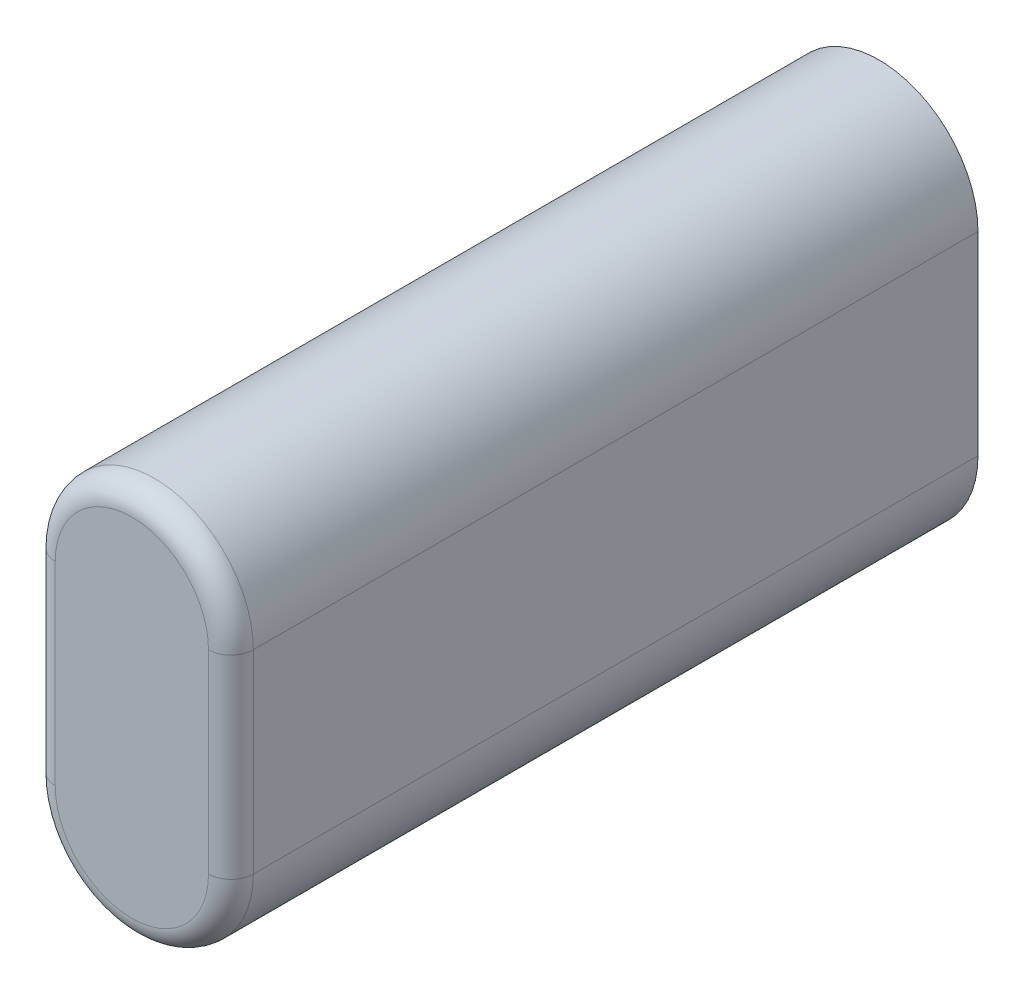
ISO-10303-21;
HEADER;
FILE_DESCRIPTION(('STEP AP214'),'2;1');
FILE_NAME('part.step','',(''),(''),'','','');
FILE_SCHEMA(('AUTOMOTIVE_DESIGN { 1 0 10303 214 1 1 1 1 }'));
ENDSEC;
DATA;
#1=APPLICATION_CONTEXT('core data for automotive mechanical design processes');
#2=APPLICATION_PROTOCOL_DEFINITION('international standard','automotive_design',2000,#1);
#3=PRODUCT_CONTEXT('',#1,'mechanical');
#4=PRODUCT('Part','Part','',(#3));
#5=PRODUCT_RELATED_PRODUCT_CATEGORY('part','',(#4));
#6=PRODUCT_DEFINITION_FORMATION('','',#4);
#7=PRODUCT_DEFINITION_CONTEXT('part definition',#1,'design');
#8=PRODUCT_DEFINITION('design','',#6,#7);
#9=PRODUCT_DEFINITION_SHAPE('','',#8);
#10=(LENGTH_UNIT() NAMED_UNIT(*) SI_UNIT(.MILLI.,.METRE.));
#11=(NAMED_UNIT(*) PLANE_ANGLE_UNIT() SI_UNIT($,.RADIAN.));
#12=(NAMED_UNIT(*) SI_UNIT($,.STERADIAN.) SOLID_ANGLE_UNIT());
#13=UNCERTAINTY_MEASURE_WITH_UNIT(LENGTH_MEASURE(1.E-05),#10,'distance_accuracy_value','');
#14=(GEOMETRIC_REPRESENTATION_CONTEXT(3) GLOBAL_UNCERTAINTY_ASSIGNED_CONTEXT((#13)) GLOBAL_UNIT_ASSIGNED_CONTEXT((#10,
#11,#12)) REPRESENTATION_CONTEXT('',''));
#15=CARTESIAN_POINT('',(0.,0.,0.));
#16=DIRECTION('',(0.,0.,1.));
#17=DIRECTION('',(1.,0.,0.));
#18=AXIS2_PLACEMENT_3D('',#15,#16,#17);
#19=CARTESIAN_POINT('',(0.,17.78,5.969));
#20=DIRECTION('',(0.,0.,-1.));
#21=DIRECTION('',(-1.,0.,0.));
#22=AXIS2_PLACEMENT_3D('',#19,#20,#21);
#23=TOROIDAL_SURFACE('',#22,1.30284677629166,0.381);
#24=CARTESIAN_POINT('',(-1.30284677629167,17.78,5.969));
#25=DIRECTION('',(0.,1.,0.));
#26=DIRECTION('',(-1.,0.,0.));
#27=AXIS2_PLACEMENT_3D('',#24,#25,#26);
#28=CIRCLE('',#27,0.381);
#29=CARTESIAN_POINT('',(-1.30284677629167,17.78,6.35));
#30=VERTEX_POINT('',#29);
#31=CARTESIAN_POINT('',(-1.68384677629167,17.78,5.969));
#32=VERTEX_POINT('',#31);
#33=EDGE_CURVE('E122',#30,#32,#28,.F.);
#34=ORIENTED_EDGE('',*,*,#33,.F.);
#35=CARTESIAN_POINT('',(0.,17.78,6.35));
#36=DIRECTION('',(0.,0.,-1.));
#37=DIRECTION('',(-1.,0.,0.));
#38=AXIS2_PLACEMENT_3D('',#35,#36,#37);
#39=CIRCLE('',#38,1.30284677629167);
#40=CARTESIAN_POINT('',(1.30284677629166,17.78,6.35));
#41=VERTEX_POINT('',#40);
#42=EDGE_CURVE('E71',#41,#30,#39,.F.);
#43=ORIENTED_EDGE('',*,*,#42,.F.);
#44=CARTESIAN_POINT('',(1.30284677629166,17.78,5.969));
#45=DIRECTION('',(0.,-1.,0.));
#46=DIRECTION('',(1.,0.,0.));
#47=AXIS2_PLACEMENT_3D('',#44,#45,#46);
#48=CIRCLE('',#47,0.381);
#49=CARTESIAN_POINT('',(1.68384677629166,17.78,5.969));
#50=VERTEX_POINT('',#49);
#51=EDGE_CURVE('E57',#50,#41,#48,.T.);
#52=ORIENTED_EDGE('',*,*,#51,.F.);
#53=CARTESIAN_POINT('',(0.,17.78,5.969));
#54=DIRECTION('',(0.,0.,1.));
#55=DIRECTION('',(1.,0.,0.));
#56=AXIS2_PLACEMENT_3D('',#53,#54,#55);
#57=CIRCLE('',#56,1.68384677629166);
#58=EDGE_CURVE('E83',#32,#50,#57,.F.);
#59=ORIENTED_EDGE('',*,*,#58,.F.);
#60=EDGE_LOOP('',(#34,#43,#52,#59));
#61=FACE_BOUND('',#60,.T.);
#62=ADVANCED_FACE('F17',(#61),#23,.T.);
#63=CARTESIAN_POINT('',(0.,16.129,6.35));
#64=DIRECTION('',(0.,0.,1.));
#65=DIRECTION('',(1.,0.,0.));
#66=AXIS2_PLACEMENT_3D('',#63,#64,#65);
#67=PLANE('',#66);
#68=DIRECTION('',(0.,-1.,0.));
#69=VECTOR('',#68,1.);
#70=CARTESIAN_POINT('',(1.30284677629165,16.9545,6.35));
#71=LINE('',#70,#69);
#72=CARTESIAN_POINT('',(1.30284677629166,14.478,6.35));
#73=VERTEX_POINT('',#72);
#74=EDGE_CURVE('E76',#41,#73,#71,.T.);
#75=ORIENTED_EDGE('',*,*,#74,.F.);
#76=ORIENTED_EDGE('',*,*,#42,.T.);
#77=DIRECTION('',(0.,1.,0.));
#78=VECTOR('',#77,1.);
#79=CARTESIAN_POINT('',(-1.30284677629167,15.3035,6.35));
#80=LINE('',#79,#78);
#81=CARTESIAN_POINT('',(-1.30284677629167,14.478,6.35));
#82=VERTEX_POINT('',#81);
#83=EDGE_CURVE('E90',#82,#30,#80,.T.);
#84=ORIENTED_EDGE('',*,*,#83,.F.);
#85=CARTESIAN_POINT('',(0.,14.478,6.35));
#86=DIRECTION('',(0.,0.,-1.));
#87=DIRECTION('',(1.,0.,0.));
#88=AXIS2_PLACEMENT_3D('',#85,#86,#87);
#89=CIRCLE('',#88,1.30284677629166);
#90=EDGE_CURVE('E86',#73,#82,#89,.T.);
#91=ORIENTED_EDGE('',*,*,#90,.F.);
#92=EDGE_LOOP('',(#75,#76,#84,#91));
#93=FACE_BOUND('',#92,.T.);
#94=ADVANCED_FACE('F88',(#93),#67,.T.);
#95=CARTESIAN_POINT('',(-1.30284677629167,15.3035,5.969));
#96=DIRECTION('',(0.,1.,0.));
#97=DIRECTION('',(-1.,0.,0.));
#98=AXIS2_PLACEMENT_3D('',#95,#96,#97);
#99=CYLINDRICAL_SURFACE('',#98,0.381);
#100=ORIENTED_EDGE('',*,*,#33,.T.);
#101=DIRECTION('',(0.,-1.,0.));
#102=VECTOR('',#101,1.);
#103=CARTESIAN_POINT('',(-1.68384677629167,14.478,5.969));
#104=LINE('',#103,#102);
#105=CARTESIAN_POINT('',(-1.68384677629167,14.478,5.969));
#106=VERTEX_POINT('',#105);
#107=EDGE_CURVE('E130',#106,#32,#104,.F.);
#108=ORIENTED_EDGE('',*,*,#107,.F.);
#109=CARTESIAN_POINT('',(-1.30284677629167,14.478,5.969));
#110=DIRECTION('',(0.,1.,0.));
#111=DIRECTION('',(-1.,0.,0.));
#112=AXIS2_PLACEMENT_3D('',#109,#110,#111);
#113=CIRCLE('',#112,0.381);
#114=EDGE_CURVE('E95',#82,#106,#113,.F.);
#115=ORIENTED_EDGE('',*,*,#114,.F.);
#116=ORIENTED_EDGE('',*,*,#83,.T.);
#117=EDGE_LOOP('',(#100,#108,#115,#116));
#118=FACE_BOUND('',#117,.T.);
#119=ADVANCED_FACE('F143',(#118),#99,.T.);
#120=CARTESIAN_POINT('',(1.30284677629166,16.9545,5.969));
#121=DIRECTION('',(0.,-1.,0.));
#122=DIRECTION('',(1.,0.,0.));
#123=AXIS2_PLACEMENT_3D('',#120,#121,#122);
#124=CYLINDRICAL_SURFACE('',#123,0.381);
#125=ORIENTED_EDGE('',*,*,#51,.T.);
#126=ORIENTED_EDGE('',*,*,#74,.T.);
#127=CARTESIAN_POINT('',(1.30284677629166,14.478,5.969));
#128=DIRECTION('',(0.,-1.,0.));
#129=DIRECTION('',(1.,0.,0.));
#130=AXIS2_PLACEMENT_3D('',#127,#128,#129);
#131=CIRCLE('',#130,0.381);
#132=CARTESIAN_POINT('',(1.68384677629166,14.478,5.969));
#133=VERTEX_POINT('',#132);
#134=EDGE_CURVE('E80',#133,#73,#131,.T.);
#135=ORIENTED_EDGE('',*,*,#134,.F.);
#136=DIRECTION('',(0.,1.,0.));
#137=VECTOR('',#136,1.);
#138=CARTESIAN_POINT('',(1.68384677629165,17.78,5.969));
#139=LINE('',#138,#137);
#140=EDGE_CURVE('E111',#50,#133,#139,.F.);
#141=ORIENTED_EDGE('',*,*,#140,.F.);
#142=EDGE_LOOP('',(#125,#126,#135,#141));
#143=FACE_BOUND('',#142,.T.);
#144=ADVANCED_FACE('F78',(#143),#124,.T.);
#145=CARTESIAN_POINT('',(0.,17.78,0.));
#146=DIRECTION('',(0.,0.,1.));
#147=DIRECTION('',(1.,0.,0.));
#148=AXIS2_PLACEMENT_3D('',#145,#146,#147);
#149=CYLINDRICAL_SURFACE('',#148,1.68384677629166);
#150=CARTESIAN_POINT('',(0.,17.78,-6.35));
#151=DIRECTION('',(0.,0.,1.));
#152=DIRECTION('',(1.,0.,0.));
#153=AXIS2_PLACEMENT_3D('',#150,#151,#152);
#154=CIRCLE('',#153,1.68384677629166);
#155=CARTESIAN_POINT('',(1.68384677629165,17.78,-6.35));
#156=VERTEX_POINT('',#155);
#157=CARTESIAN_POINT('',(-1.68384677629167,17.78,-6.35));
#158=VERTEX_POINT('',#157);
#159=EDGE_CURVE('E22',#156,#158,#154,.T.);
#160=ORIENTED_EDGE('',*,*,#159,.T.);
#161=DIRECTION('',(0.,0.,1.));
#162=VECTOR('',#161,1.);
#163=CARTESIAN_POINT('',(-1.68384677629167,17.78,0.));
#164=LINE('',#163,#162);
#165=EDGE_CURVE('E127',#32,#158,#164,.F.);
#166=ORIENTED_EDGE('',*,*,#165,.F.);
#167=ORIENTED_EDGE('',*,*,#58,.T.);
#168=DIRECTION('',(0.,0.,1.));
#169=VECTOR('',#168,1.);
#170=CARTESIAN_POINT('',(1.68384677629165,17.78,0.));
#171=LINE('',#170,#169);
#172=EDGE_CURVE('E116',#156,#50,#171,.T.);
#173=ORIENTED_EDGE('',*,*,#172,.F.);
#174=EDGE_LOOP('',(#160,#166,#167,#173));
#175=FACE_BOUND('',#174,.T.);
#176=ADVANCED_FACE('F146',(#175),#149,.T.);
#177=CARTESIAN_POINT('',(0.,14.478,5.969));
#178=DIRECTION('',(0.,0.,-1.));
#179=DIRECTION('',(-1.,0.,0.));
#180=AXIS2_PLACEMENT_3D('',#177,#178,#179);
#181=TOROIDAL_SURFACE('',#180,1.30284677629166,0.381);
#182=ORIENTED_EDGE('',*,*,#114,.T.);
#183=CARTESIAN_POINT('',(0.,14.478,5.969));
#184=DIRECTION('',(0.,0.,1.));
#185=DIRECTION('',(1.,0.,0.));
#186=AXIS2_PLACEMENT_3D('',#183,#184,#185);
#187=CIRCLE('',#186,1.68384677629166);
#188=EDGE_CURVE('E100',#133,#106,#187,.F.);
#189=ORIENTED_EDGE('',*,*,#188,.F.);
#190=ORIENTED_EDGE('',*,*,#134,.T.);
#191=ORIENTED_EDGE('',*,*,#90,.T.);
#192=EDGE_LOOP('',(#182,#189,#190,#191));
#193=FACE_BOUND('',#192,.T.);
#194=ADVANCED_FACE('F98',(#193),#181,.T.);
#195=CARTESIAN_POINT('',(-1.68384677629167,14.478,0.));
#196=DIRECTION('',(-1.,0.,0.));
#197=DIRECTION('',(0.,-1.,0.));
#198=AXIS2_PLACEMENT_3D('',#195,#196,#197);
#199=PLANE('',#198);
#200=DIRECTION('',(0.,1.,0.));
#201=VECTOR('',#200,1.);
#202=CARTESIAN_POINT('',(-1.68384677629167,16.129,-6.35));
#203=LINE('',#202,#201);
#204=CARTESIAN_POINT('',(-1.68384677629167,14.478,-6.35));
#205=VERTEX_POINT('',#204);
#206=EDGE_CURVE('E113',#158,#205,#203,.F.);
#207=ORIENTED_EDGE('',*,*,#206,.T.);
#208=DIRECTION('',(0.,0.,1.));
#209=VECTOR('',#208,1.);
#210=CARTESIAN_POINT('',(-1.68384677629167,14.478,0.));
#211=LINE('',#210,#209);
#212=EDGE_CURVE('E151',#106,#205,#211,.F.);
#213=ORIENTED_EDGE('',*,*,#212,.F.);
#214=ORIENTED_EDGE('',*,*,#107,.T.);
#215=ORIENTED_EDGE('',*,*,#165,.T.);
#216=EDGE_LOOP('',(#207,#213,#214,#215));
#217=FACE_BOUND('',#216,.T.);
#218=ADVANCED_FACE('F149',(#217),#199,.T.);
#219=CARTESIAN_POINT('',(0.,16.129,-6.35));
#220=DIRECTION('',(0.,0.,1.));
#221=DIRECTION('',(1.,0.,0.));
#222=AXIS2_PLACEMENT_3D('',#219,#220,#221);
#223=PLANE('',#222);
#224=CARTESIAN_POINT('',(0.,14.478,-6.35));
#225=DIRECTION('',(0.,0.,1.));
#226=DIRECTION('',(1.,0.,0.));
#227=AXIS2_PLACEMENT_3D('',#224,#225,#226);
#228=CIRCLE('',#227,1.68384677629166);
#229=CARTESIAN_POINT('',(1.68384677629166,14.478,-6.35));
#230=VERTEX_POINT('',#229);
#231=EDGE_CURVE('E28',#205,#230,#228,.T.);
#232=ORIENTED_EDGE('',*,*,#231,.F.);
#233=ORIENTED_EDGE('',*,*,#206,.F.);
#234=ORIENTED_EDGE('',*,*,#159,.F.);
#235=DIRECTION('',(0.,1.,0.));
#236=VECTOR('',#235,1.);
#237=CARTESIAN_POINT('',(1.68384677629165,17.78,-6.35));
#238=LINE('',#237,#236);
#239=EDGE_CURVE('E37',#230,#156,#238,.T.);
#240=ORIENTED_EDGE('',*,*,#239,.F.);
#241=EDGE_LOOP('',(#232,#233,#234,#240));
#242=FACE_BOUND('',#241,.T.);
#243=ADVANCED_FACE('F195',(#242),#223,.F.);
#244=CARTESIAN_POINT('',(1.68384677629165,17.78,0.));
#245=DIRECTION('',(1.,0.,0.));
#246=DIRECTION('',(0.,1.,0.));
#247=AXIS2_PLACEMENT_3D('',#244,#245,#246);
#248=PLANE('',#247);
#249=ORIENTED_EDGE('',*,*,#239,.T.);
#250=ORIENTED_EDGE('',*,*,#172,.T.);
#251=ORIENTED_EDGE('',*,*,#140,.T.);
#252=DIRECTION('',(0.,0.,1.));
#253=VECTOR('',#252,1.);
#254=CARTESIAN_POINT('',(1.68384677629166,14.478,0.));
#255=LINE('',#254,#253);
#256=EDGE_CURVE('E11',#230,#133,#255,.T.);
#257=ORIENTED_EDGE('',*,*,#256,.F.);
#258=EDGE_LOOP('',(#249,#250,#251,#257));
#259=FACE_BOUND('',#258,.T.);
#260=ADVANCED_FACE('F197',(#259),#248,.T.);
#261=CARTESIAN_POINT('',(0.,14.478,0.));
#262=DIRECTION('',(0.,0.,1.));
#263=DIRECTION('',(1.,0.,0.));
#264=AXIS2_PLACEMENT_3D('',#261,#262,#263);
#265=CYLINDRICAL_SURFACE('',#264,1.68384677629166);
#266=ORIENTED_EDGE('',*,*,#231,.T.);
#267=ORIENTED_EDGE('',*,*,#256,.T.);
#268=ORIENTED_EDGE('',*,*,#188,.T.);
#269=ORIENTED_EDGE('',*,*,#212,.T.);
#270=EDGE_LOOP('',(#266,#267,#268,#269));
#271=FACE_BOUND('',#270,.T.);
#272=ADVANCED_FACE('F203',(#271),#265,.T.);
#273=CLOSED_SHELL('',(#62,#94,#119,#144,#176,#194,#218,#243,#260,#272));
#274=MANIFOLD_SOLID_BREP('B1',#273);
#275=ADVANCED_BREP_SHAPE_REPRESENTATION('',(#18,#274),#14);
#276=SHAPE_DEFINITION_REPRESENTATION(#9,#275);
ENDSEC;
END-ISO-10303-21;
